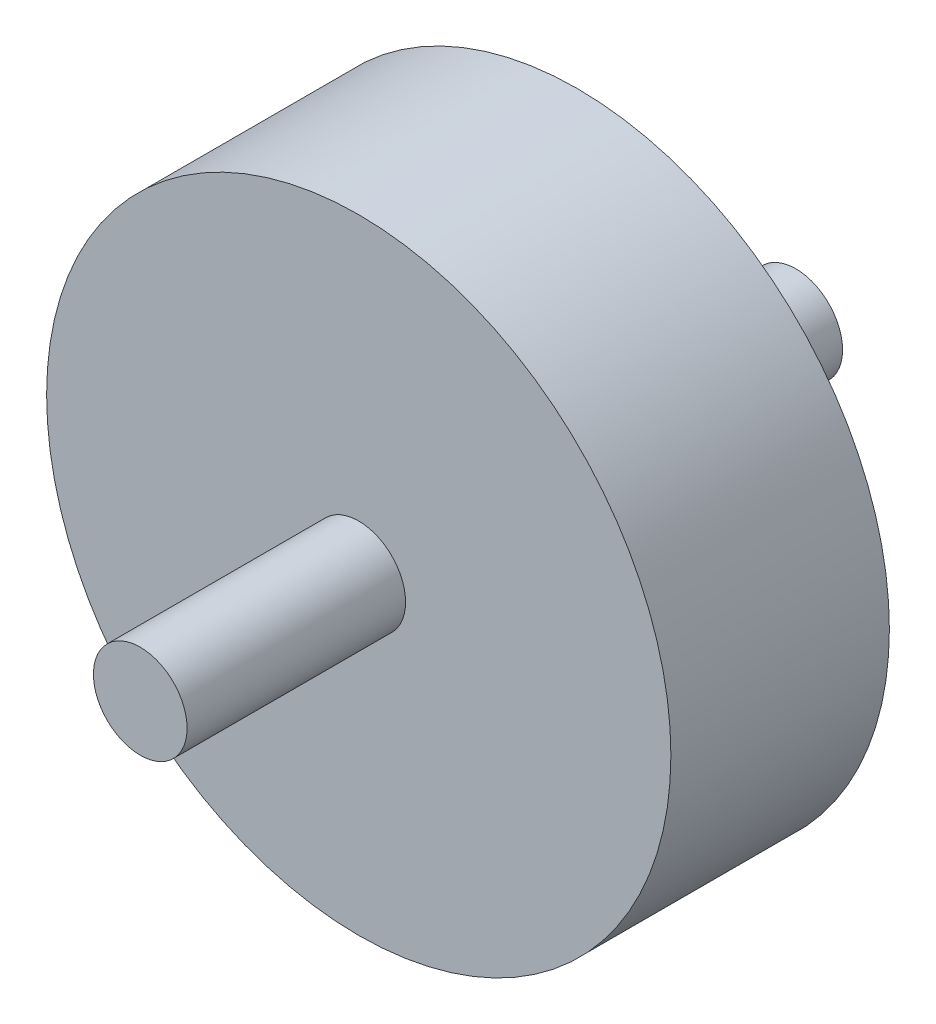
ISO-10303-21;
HEADER;
FILE_DESCRIPTION(('STEP AP214'),'2;1');
FILE_NAME('part.step','',(''),(''),'','','');
FILE_SCHEMA(('AUTOMOTIVE_DESIGN { 1 0 10303 214 1 1 1 1 }'));
ENDSEC;
DATA;
#1=APPLICATION_CONTEXT('core data for automotive mechanical design processes');
#2=APPLICATION_PROTOCOL_DEFINITION('international standard','automotive_design',2000,#1);
#3=PRODUCT_CONTEXT('',#1,'mechanical');
#4=PRODUCT('Part','Part','',(#3));
#5=PRODUCT_RELATED_PRODUCT_CATEGORY('part','',(#4));
#6=PRODUCT_DEFINITION_FORMATION('','',#4);
#7=PRODUCT_DEFINITION_CONTEXT('part definition',#1,'design');
#8=PRODUCT_DEFINITION('design','',#6,#7);
#9=PRODUCT_DEFINITION_SHAPE('','',#8);
#10=(LENGTH_UNIT() NAMED_UNIT(*) SI_UNIT(.MILLI.,.METRE.));
#11=(NAMED_UNIT(*) PLANE_ANGLE_UNIT() SI_UNIT($,.RADIAN.));
#12=(NAMED_UNIT(*) SI_UNIT($,.STERADIAN.) SOLID_ANGLE_UNIT());
#13=UNCERTAINTY_MEASURE_WITH_UNIT(LENGTH_MEASURE(1.E-05),#10,'distance_accuracy_value','');
#14=(GEOMETRIC_REPRESENTATION_CONTEXT(3) GLOBAL_UNCERTAINTY_ASSIGNED_CONTEXT((#13)) GLOBAL_UNIT_ASSIGNED_CONTEXT((#10,
#11,#12)) REPRESENTATION_CONTEXT('',''));
#15=CARTESIAN_POINT('',(0.,0.,0.));
#16=DIRECTION('',(0.,0.,1.));
#17=DIRECTION('',(1.,0.,0.));
#18=AXIS2_PLACEMENT_3D('',#15,#16,#17);
#19=CARTESIAN_POINT('',(0.,0.,35.));
#20=DIRECTION('',(0.,0.,-1.));
#21=DIRECTION('',(-1.,0.,0.));
#22=AXIS2_PLACEMENT_3D('',#19,#20,#21);
#23=CYLINDRICAL_SURFACE('',#22,50.);
#24=CARTESIAN_POINT('',(0.,0.,35.));
#25=DIRECTION('',(0.,0.,1.));
#26=DIRECTION('',(1.,0.,0.));
#27=AXIS2_PLACEMENT_3D('',#24,#25,#26);
#28=CIRCLE('',#27,50.);
#29=CARTESIAN_POINT('',(50.,0.,35.));
#30=VERTEX_POINT('',#29);
#31=EDGE_CURVE('E39',#30,#30,#28,.T.);
#32=ORIENTED_EDGE('',*,*,#31,.F.);
#33=EDGE_LOOP('',(#32));
#34=FACE_BOUND('',#33,.T.);
#35=CARTESIAN_POINT('',(0.,0.,0.));
#36=DIRECTION('',(0.,0.,1.));
#37=DIRECTION('',(1.,0.,0.));
#38=AXIS2_PLACEMENT_3D('',#35,#36,#37);
#39=CIRCLE('',#38,50.);
#40=CARTESIAN_POINT('',(50.,0.,0.));
#41=VERTEX_POINT('',#40);
#42=EDGE_CURVE('E44',#41,#41,#39,.T.);
#43=ORIENTED_EDGE('',*,*,#42,.T.);
#44=EDGE_LOOP('',(#43));
#45=FACE_BOUND('',#44,.T.);
#46=ADVANCED_FACE('F32',(#34,#45),#23,.T.);
#47=CARTESIAN_POINT('',(0.,0.,35.));
#48=DIRECTION('',(0.,0.,1.));
#49=DIRECTION('',(1.,0.,0.));
#50=AXIS2_PLACEMENT_3D('',#47,#48,#49);
#51=PLANE('',#50);
#52=CARTESIAN_POINT('',(0.,0.,35.));
#53=DIRECTION('',(0.,0.,1.));
#54=DIRECTION('',(1.,0.,0.));
#55=AXIS2_PLACEMENT_3D('',#52,#53,#54);
#56=CIRCLE('',#55,7.5);
#57=CARTESIAN_POINT('',(7.5,0.,35.));
#58=VERTEX_POINT('',#57);
#59=EDGE_CURVE('E10',#58,#58,#56,.T.);
#60=ORIENTED_EDGE('',*,*,#59,.F.);
#61=EDGE_LOOP('',(#60));
#62=FACE_BOUND('',#61,.T.);
#63=ORIENTED_EDGE('',*,*,#31,.T.);
#64=EDGE_LOOP('',(#63));
#65=FACE_BOUND('',#64,.T.);
#66=ADVANCED_FACE('F77',(#62,#65),#51,.T.);
#67=CARTESIAN_POINT('',(0.,0.,0.));
#68=DIRECTION('',(0.,0.,1.));
#69=DIRECTION('',(1.,0.,0.));
#70=AXIS2_PLACEMENT_3D('',#67,#68,#69);
#71=PLANE('',#70);
#72=CARTESIAN_POINT('',(0.,0.,0.));
#73=DIRECTION('',(0.,0.,1.));
#74=DIRECTION('',(1.,0.,0.));
#75=AXIS2_PLACEMENT_3D('',#72,#73,#74);
#76=CIRCLE('',#75,7.5);
#77=CARTESIAN_POINT('',(7.5,0.,0.));
#78=VERTEX_POINT('',#77);
#79=EDGE_CURVE('E35',#78,#78,#76,.T.);
#80=ORIENTED_EDGE('',*,*,#79,.T.);
#81=EDGE_LOOP('',(#80));
#82=FACE_BOUND('',#81,.T.);
#83=ORIENTED_EDGE('',*,*,#42,.F.);
#84=EDGE_LOOP('',(#83));
#85=FACE_BOUND('',#84,.T.);
#86=ADVANCED_FACE('F82',(#82,#85),#71,.F.);
#87=CARTESIAN_POINT('',(0.,0.,-35.));
#88=DIRECTION('',(0.,0.,1.));
#89=DIRECTION('',(1.,0.,0.));
#90=AXIS2_PLACEMENT_3D('',#87,#88,#89);
#91=PLANE('',#90);
#92=CARTESIAN_POINT('',(0.,0.,-35.));
#93=DIRECTION('',(0.,0.,1.));
#94=DIRECTION('',(1.,0.,0.));
#95=AXIS2_PLACEMENT_3D('',#92,#93,#94);
#96=CIRCLE('',#95,7.5);
#97=CARTESIAN_POINT('',(7.5,0.,-35.));
#98=VERTEX_POINT('',#97);
#99=EDGE_CURVE('E47',#98,#98,#96,.T.);
#100=ORIENTED_EDGE('',*,*,#99,.F.);
#101=EDGE_LOOP('',(#100));
#102=FACE_BOUND('',#101,.T.);
#103=ADVANCED_FACE('F73',(#102),#91,.F.);
#104=CARTESIAN_POINT('',(0.,0.,-35.));
#105=DIRECTION('',(0.,0.,1.));
#106=DIRECTION('',(1.,0.,0.));
#107=AXIS2_PLACEMENT_3D('',#104,#105,#106);
#108=CYLINDRICAL_SURFACE('',#107,7.5);
#109=ORIENTED_EDGE('',*,*,#99,.T.);
#110=EDGE_LOOP('',(#109));
#111=FACE_BOUND('',#110,.T.);
#112=ORIENTED_EDGE('',*,*,#79,.F.);
#113=EDGE_LOOP('',(#112));
#114=FACE_BOUND('',#113,.T.);
#115=ADVANCED_FACE('F66',(#111,#114),#108,.T.);
#116=ORIENTED_EDGE('',*,*,#59,.T.);
#117=EDGE_LOOP('',(#116));
#118=FACE_BOUND('',#117,.T.);
#119=CARTESIAN_POINT('',(0.,0.,70.));
#120=DIRECTION('',(0.,0.,1.));
#121=DIRECTION('',(1.,0.,0.));
#122=AXIS2_PLACEMENT_3D('',#119,#120,#121);
#123=CIRCLE('',#122,7.5);
#124=CARTESIAN_POINT('',(7.5,0.,70.));
#125=VERTEX_POINT('',#124);
#126=EDGE_CURVE('E56',#125,#125,#123,.T.);
#127=ORIENTED_EDGE('',*,*,#126,.F.);
#128=EDGE_LOOP('',(#127));
#129=FACE_BOUND('',#128,.T.);
#130=ADVANCED_FACE('F64',(#118,#129),#108,.T.);
#131=CARTESIAN_POINT('',(0.,0.,70.));
#132=DIRECTION('',(0.,0.,1.));
#133=DIRECTION('',(1.,0.,0.));
#134=AXIS2_PLACEMENT_3D('',#131,#132,#133);
#135=PLANE('',#134);
#136=ORIENTED_EDGE('',*,*,#126,.T.);
#137=EDGE_LOOP('',(#136));
#138=FACE_BOUND('',#137,.T.);
#139=ADVANCED_FACE('F62',(#138),#135,.T.);
#140=CLOSED_SHELL('',(#46,#66,#86,#103,#115,#130,#139));
#141=MANIFOLD_SOLID_BREP('B2',#140);
#142=ADVANCED_BREP_SHAPE_REPRESENTATION('',(#18,#141),#14);
#143=SHAPE_DEFINITION_REPRESENTATION(#9,#142);
ENDSEC;
END-ISO-10303-21;
